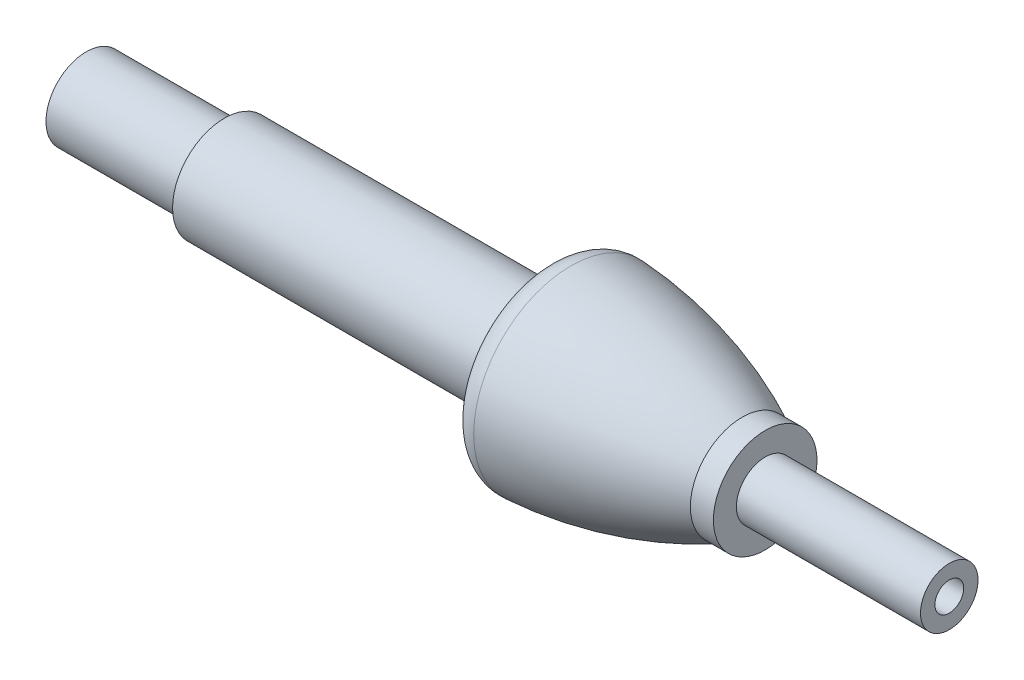
ISO-10303-21;
HEADER;
FILE_DESCRIPTION(('STEP AP214'),'2;1');
FILE_NAME('part.step','',(''),(''),'','','');
FILE_SCHEMA(('AUTOMOTIVE_DESIGN { 1 0 10303 214 1 1 1 1 }'));
ENDSEC;
DATA;
#1=APPLICATION_CONTEXT('core data for automotive mechanical design processes');
#2=APPLICATION_PROTOCOL_DEFINITION('international standard','automotive_design',2000,#1);
#3=PRODUCT_CONTEXT('',#1,'mechanical');
#4=PRODUCT('Part','Part','',(#3));
#5=PRODUCT_RELATED_PRODUCT_CATEGORY('part','',(#4));
#6=PRODUCT_DEFINITION_FORMATION('','',#4);
#7=PRODUCT_DEFINITION_CONTEXT('part definition',#1,'design');
#8=PRODUCT_DEFINITION('design','',#6,#7);
#9=PRODUCT_DEFINITION_SHAPE('','',#8);
#10=(LENGTH_UNIT() NAMED_UNIT(*) SI_UNIT(.MILLI.,.METRE.));
#11=(NAMED_UNIT(*) PLANE_ANGLE_UNIT() SI_UNIT($,.RADIAN.));
#12=(NAMED_UNIT(*) SI_UNIT($,.STERADIAN.) SOLID_ANGLE_UNIT());
#13=UNCERTAINTY_MEASURE_WITH_UNIT(LENGTH_MEASURE(1.E-05),#10,'distance_accuracy_value','');
#14=(GEOMETRIC_REPRESENTATION_CONTEXT(3) GLOBAL_UNCERTAINTY_ASSIGNED_CONTEXT((#13)) GLOBAL_UNIT_ASSIGNED_CONTEXT((#10,
#11,#12)) REPRESENTATION_CONTEXT('',''));
#15=CARTESIAN_POINT('',(0.,0.,0.));
#16=DIRECTION('',(0.,0.,1.));
#17=DIRECTION('',(1.,0.,0.));
#18=AXIS2_PLACEMENT_3D('',#15,#16,#17);
#19=CARTESIAN_POINT('',(-37.5,0.,0.));
#20=DIRECTION('',(-1.,0.,0.));
#21=DIRECTION('',(0.,0.,1.));
#22=AXIS2_PLACEMENT_3D('',#19,#20,#21);
#23=CYLINDRICAL_SURFACE('',#22,4.5);
#24=CARTESIAN_POINT('',(-25.5,0.,0.));
#25=DIRECTION('',(-1.,0.,0.));
#26=DIRECTION('',(0.,0.,1.));
#27=AXIS2_PLACEMENT_3D('',#24,#25,#26);
#28=CIRCLE('',#27,4.5);
#29=CARTESIAN_POINT('',(-25.5,0.,4.5));
#30=VERTEX_POINT('',#29);
#31=EDGE_CURVE('E81',#30,#30,#28,.T.);
#32=ORIENTED_EDGE('',*,*,#31,.F.);
#33=EDGE_LOOP('',(#32));
#34=FACE_BOUND('',#33,.T.);
#35=CARTESIAN_POINT('',(2.5,0.,0.));
#36=DIRECTION('',(-1.,0.,0.));
#37=DIRECTION('',(0.,0.,1.));
#38=AXIS2_PLACEMENT_3D('',#35,#36,#37);
#39=CIRCLE('',#38,4.5);
#40=CARTESIAN_POINT('',(2.5,0.,4.5));
#41=VERTEX_POINT('',#40);
#42=EDGE_CURVE('E50',#41,#41,#39,.T.);
#43=ORIENTED_EDGE('',*,*,#42,.T.);
#44=EDGE_LOOP('',(#43));
#45=FACE_BOUND('',#44,.T.);
#46=ADVANCED_FACE('F37',(#34,#45),#23,.T.);
#47=CARTESIAN_POINT('',(2.5,4.5,0.));
#48=DIRECTION('',(1.,0.,0.));
#49=DIRECTION('',(0.,0.,-1.));
#50=AXIS2_PLACEMENT_3D('',#47,#48,#49);
#51=PLANE('',#50);
#52=CARTESIAN_POINT('',(2.5,0.,0.));
#53=DIRECTION('',(1.,0.,0.));
#54=DIRECTION('',(0.,0.,-1.));
#55=AXIS2_PLACEMENT_3D('',#52,#53,#54);
#56=CIRCLE('',#55,6.44459418956637);
#57=CARTESIAN_POINT('',(2.5,0.,-6.44459418956637));
#58=VERTEX_POINT('',#57);
#59=EDGE_CURVE('E45',#58,#58,#56,.F.);
#60=ORIENTED_EDGE('',*,*,#59,.T.);
#61=EDGE_LOOP('',(#60));
#62=FACE_BOUND('',#61,.T.);
#63=ORIENTED_EDGE('',*,*,#42,.F.);
#64=EDGE_LOOP('',(#63));
#65=FACE_BOUND('',#64,.T.);
#66=ADVANCED_FACE('F122',(#62,#65),#51,.F.);
#67=CARTESIAN_POINT('',(2.5,0.,0.));
#68=DIRECTION('',(-1.,0.,0.));
#69=DIRECTION('',(0.,0.,1.));
#70=AXIS2_PLACEMENT_3D('',#67,#68,#69);
#71=DEGENERATE_TOROIDAL_SURFACE('',#70,29.625,38.125,.F.);
#72=CARTESIAN_POINT('',(4.61072664359862,0.,0.));
#73=DIRECTION('',(-1.,0.,0.));
#74=DIRECTION('',(0.,0.,1.));
#75=AXIS2_PLACEMENT_3D('',#72,#73,#74);
#76=CIRCLE('',#75,8.44152673985378);
#77=CARTESIAN_POINT('',(4.61072664359862,0.,8.44152673985378));
#78=VERTEX_POINT('',#77);
#79=EDGE_CURVE('E10',#78,#78,#76,.F.);
#80=ORIENTED_EDGE('',*,*,#79,.T.);
#81=EDGE_LOOP('',(#80));
#82=FACE_BOUND('',#81,.T.);
#83=CARTESIAN_POINT('',(19.5,0.,0.));
#84=DIRECTION('',(-1.,0.,0.));
#85=DIRECTION('',(0.,0.,1.));
#86=AXIS2_PLACEMENT_3D('',#83,#84,#85);
#87=CIRCLE('',#86,4.5);
#88=CARTESIAN_POINT('',(19.5,0.,4.5));
#89=VERTEX_POINT('',#88);
#90=EDGE_CURVE('E55',#89,#89,#87,.T.);
#91=ORIENTED_EDGE('',*,*,#90,.T.);
#92=EDGE_LOOP('',(#91));
#93=FACE_BOUND('',#92,.T.);
#94=ADVANCED_FACE('F127',(#82,#93),#71,.F.);
#95=CARTESIAN_POINT('',(-37.5,0.,0.));
#96=DIRECTION('',(-1.,0.,0.));
#97=DIRECTION('',(0.,0.,1.));
#98=AXIS2_PLACEMENT_3D('',#95,#96,#97);
#99=CYLINDRICAL_SURFACE('',#98,4.5);
#100=ORIENTED_EDGE('',*,*,#90,.F.);
#101=EDGE_LOOP('',(#100));
#102=FACE_BOUND('',#101,.T.);
#103=CARTESIAN_POINT('',(21.5,0.,0.));
#104=DIRECTION('',(-1.,0.,0.));
#105=DIRECTION('',(0.,0.,1.));
#106=AXIS2_PLACEMENT_3D('',#103,#104,#105);
#107=CIRCLE('',#106,4.5);
#108=CARTESIAN_POINT('',(21.5,0.,4.5));
#109=VERTEX_POINT('',#108);
#110=EDGE_CURVE('E61',#109,#109,#107,.T.);
#111=ORIENTED_EDGE('',*,*,#110,.T.);
#112=EDGE_LOOP('',(#111));
#113=FACE_BOUND('',#112,.T.);
#114=ADVANCED_FACE('F117',(#102,#113),#99,.T.);
#115=CARTESIAN_POINT('',(21.5,4.5,0.));
#116=DIRECTION('',(-1.,0.,0.));
#117=DIRECTION('',(0.,0.,1.));
#118=AXIS2_PLACEMENT_3D('',#115,#116,#117);
#119=PLANE('',#118);
#120=ORIENTED_EDGE('',*,*,#110,.F.);
#121=EDGE_LOOP('',(#120));
#122=FACE_BOUND('',#121,.T.);
#123=CARTESIAN_POINT('',(21.5,0.,0.));
#124=DIRECTION('',(-1.,0.,0.));
#125=DIRECTION('',(0.,0.,1.));
#126=AXIS2_PLACEMENT_3D('',#123,#124,#125);
#127=CIRCLE('',#126,2.50000000000001);
#128=CARTESIAN_POINT('',(21.5,0.,2.50000000000001));
#129=VERTEX_POINT('',#128);
#130=EDGE_CURVE('E65',#129,#129,#127,.T.);
#131=ORIENTED_EDGE('',*,*,#130,.T.);
#132=EDGE_LOOP('',(#131));
#133=FACE_BOUND('',#132,.T.);
#134=ADVANCED_FACE('F111',(#122,#133),#119,.F.);
#135=CARTESIAN_POINT('',(-37.5,0.,0.));
#136=DIRECTION('',(-1.,0.,0.));
#137=DIRECTION('',(0.,0.,1.));
#138=AXIS2_PLACEMENT_3D('',#135,#136,#137);
#139=CYLINDRICAL_SURFACE('',#138,2.50000000000001);
#140=ORIENTED_EDGE('',*,*,#130,.F.);
#141=EDGE_LOOP('',(#140));
#142=FACE_BOUND('',#141,.T.);
#143=CARTESIAN_POINT('',(37.5,0.,0.));
#144=DIRECTION('',(-1.,0.,0.));
#145=DIRECTION('',(0.,0.,1.));
#146=AXIS2_PLACEMENT_3D('',#143,#144,#145);
#147=CIRCLE('',#146,2.50000000000001);
#148=CARTESIAN_POINT('',(37.5,0.,2.50000000000001));
#149=VERTEX_POINT('',#148);
#150=EDGE_CURVE('E69',#149,#149,#147,.T.);
#151=ORIENTED_EDGE('',*,*,#150,.T.);
#152=EDGE_LOOP('',(#151));
#153=FACE_BOUND('',#152,.T.);
#154=ADVANCED_FACE('F106',(#142,#153),#139,.T.);
#155=CARTESIAN_POINT('',(37.5,2.50000000000001,0.));
#156=DIRECTION('',(-1.,0.,0.));
#157=DIRECTION('',(0.,0.,1.));
#158=AXIS2_PLACEMENT_3D('',#155,#156,#157);
#159=PLANE('',#158);
#160=CARTESIAN_POINT('',(37.5,0.,0.));
#161=DIRECTION('',(1.,0.,0.));
#162=DIRECTION('',(0.,0.,-1.));
#163=AXIS2_PLACEMENT_3D('',#160,#161,#162);
#164=CIRCLE('',#163,1.25);
#165=CARTESIAN_POINT('',(37.5,0.,-1.25));
#166=VERTEX_POINT('',#165);
#167=EDGE_CURVE('E86',#166,#166,#164,.T.);
#168=ORIENTED_EDGE('',*,*,#167,.F.);
#169=EDGE_LOOP('',(#168));
#170=FACE_BOUND('',#169,.T.);
#171=ORIENTED_EDGE('',*,*,#150,.F.);
#172=EDGE_LOOP('',(#171));
#173=FACE_BOUND('',#172,.T.);
#174=ADVANCED_FACE('F103',(#170,#173),#159,.F.);
#175=CARTESIAN_POINT('',(-37.5,0.,0.));
#176=DIRECTION('',(1.,0.,0.));
#177=DIRECTION('',(0.,0.,-1.));
#178=AXIS2_PLACEMENT_3D('',#175,#176,#177);
#179=PLANE('',#178);
#180=CARTESIAN_POINT('',(-37.5,0.,0.));
#181=DIRECTION('',(1.,0.,0.));
#182=DIRECTION('',(0.,0.,-1.));
#183=AXIS2_PLACEMENT_3D('',#180,#181,#182);
#184=CIRCLE('',#183,1.25);
#185=CARTESIAN_POINT('',(-37.5,0.,-1.25));
#186=VERTEX_POINT('',#185);
#187=EDGE_CURVE('E85',#186,#186,#184,.T.);
#188=ORIENTED_EDGE('',*,*,#187,.T.);
#189=EDGE_LOOP('',(#188));
#190=FACE_BOUND('',#189,.T.);
#191=CARTESIAN_POINT('',(-37.5,0.,0.));
#192=DIRECTION('',(-1.,0.,0.));
#193=DIRECTION('',(0.,0.,1.));
#194=AXIS2_PLACEMENT_3D('',#191,#192,#193);
#195=CIRCLE('',#194,3.5);
#196=CARTESIAN_POINT('',(-37.5,0.,3.5));
#197=VERTEX_POINT('',#196);
#198=EDGE_CURVE('E73',#197,#197,#195,.T.);
#199=ORIENTED_EDGE('',*,*,#198,.T.);
#200=EDGE_LOOP('',(#199));
#201=FACE_BOUND('',#200,.T.);
#202=ADVANCED_FACE('F94',(#190,#201),#179,.F.);
#203=CARTESIAN_POINT('',(-37.5,0.,0.));
#204=DIRECTION('',(-1.,0.,0.));
#205=DIRECTION('',(0.,0.,1.));
#206=AXIS2_PLACEMENT_3D('',#203,#204,#205);
#207=CYLINDRICAL_SURFACE('',#206,3.5);
#208=ORIENTED_EDGE('',*,*,#198,.F.);
#209=EDGE_LOOP('',(#208));
#210=FACE_BOUND('',#209,.T.);
#211=CARTESIAN_POINT('',(-25.5,0.,0.));
#212=DIRECTION('',(-1.,0.,0.));
#213=DIRECTION('',(0.,0.,1.));
#214=AXIS2_PLACEMENT_3D('',#211,#212,#213);
#215=CIRCLE('',#214,3.5);
#216=CARTESIAN_POINT('',(-25.5,0.,3.5));
#217=VERTEX_POINT('',#216);
#218=EDGE_CURVE('E77',#217,#217,#215,.T.);
#219=ORIENTED_EDGE('',*,*,#218,.T.);
#220=EDGE_LOOP('',(#219));
#221=FACE_BOUND('',#220,.T.);
#222=ADVANCED_FACE('F159',(#210,#221),#207,.T.);
#223=CARTESIAN_POINT('',(-25.5,3.5,0.));
#224=DIRECTION('',(1.,0.,0.));
#225=DIRECTION('',(0.,0.,-1.));
#226=AXIS2_PLACEMENT_3D('',#223,#224,#225);
#227=PLANE('',#226);
#228=ORIENTED_EDGE('',*,*,#218,.F.);
#229=EDGE_LOOP('',(#228));
#230=FACE_BOUND('',#229,.T.);
#231=ORIENTED_EDGE('',*,*,#31,.T.);
#232=EDGE_LOOP('',(#231));
#233=FACE_BOUND('',#232,.T.);
#234=ADVANCED_FACE('F164',(#230,#233),#227,.F.);
#235=CARTESIAN_POINT('',(4.5,0.,0.));
#236=DIRECTION('',(1.,0.,0.));
#237=DIRECTION('',(0.,0.,-1.));
#238=AXIS2_PLACEMENT_3D('',#235,#236,#237);
#239=TOROIDAL_SURFACE('',#238,6.44459418956637,2.);
#240=ORIENTED_EDGE('',*,*,#79,.F.);
#241=EDGE_LOOP('',(#240));
#242=FACE_BOUND('',#241,.T.);
#243=ORIENTED_EDGE('',*,*,#59,.F.);
#244=EDGE_LOOP('',(#243));
#245=FACE_BOUND('',#244,.T.);
#246=ADVANCED_FACE('F39',(#242,#245),#239,.T.);
#247=CARTESIAN_POINT('',(-37.5,0.,0.));
#248=DIRECTION('',(1.,0.,0.));
#249=DIRECTION('',(0.,0.,-1.));
#250=AXIS2_PLACEMENT_3D('',#247,#248,#249);
#251=CYLINDRICAL_SURFACE('',#250,1.25);
#252=ORIENTED_EDGE('',*,*,#187,.F.);
#253=EDGE_LOOP('',(#252));
#254=FACE_BOUND('',#253,.T.);
#255=ORIENTED_EDGE('',*,*,#167,.T.);
#256=EDGE_LOOP('',(#255));
#257=FACE_BOUND('',#256,.T.);
#258=ADVANCED_FACE('F97',(#254,#257),#251,.F.);
#259=CLOSED_SHELL('',(#46,#66,#94,#114,#134,#154,#174,#202,#222,#234,#246,#258));
#260=MANIFOLD_SOLID_BREP('B2',#259);
#261=ADVANCED_BREP_SHAPE_REPRESENTATION('',(#18,#260),#14);
#262=SHAPE_DEFINITION_REPRESENTATION(#9,#261);
ENDSEC;
END-ISO-10303-21;
